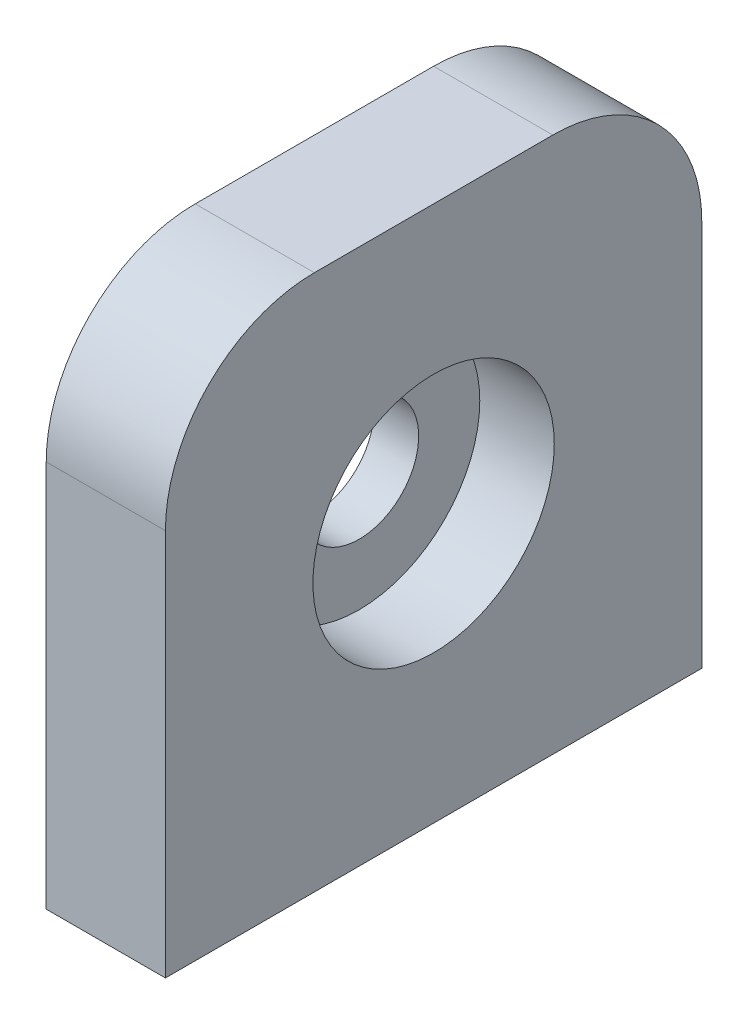
ISO-10303-21;
HEADER;
FILE_DESCRIPTION(('STEP AP214'),'2;1');
FILE_NAME('part.step','',(''),(''),'','','');
FILE_SCHEMA(('AUTOMOTIVE_DESIGN { 1 0 10303 214 1 1 1 1 }'));
ENDSEC;
DATA;
#1=APPLICATION_CONTEXT('core data for automotive mechanical design processes');
#2=APPLICATION_PROTOCOL_DEFINITION('international standard','automotive_design',2000,#1);
#3=PRODUCT_CONTEXT('',#1,'mechanical');
#4=PRODUCT('Part','Part','',(#3));
#5=PRODUCT_RELATED_PRODUCT_CATEGORY('part','',(#4));
#6=PRODUCT_DEFINITION_FORMATION('','',#4);
#7=PRODUCT_DEFINITION_CONTEXT('part definition',#1,'design');
#8=PRODUCT_DEFINITION('design','',#6,#7);
#9=PRODUCT_DEFINITION_SHAPE('','',#8);
#10=(LENGTH_UNIT() NAMED_UNIT(*) SI_UNIT(.MILLI.,.METRE.));
#11=(NAMED_UNIT(*) PLANE_ANGLE_UNIT() SI_UNIT($,.RADIAN.));
#12=(NAMED_UNIT(*) SI_UNIT($,.STERADIAN.) SOLID_ANGLE_UNIT());
#13=UNCERTAINTY_MEASURE_WITH_UNIT(LENGTH_MEASURE(1.E-05),#10,'distance_accuracy_value','');
#14=(GEOMETRIC_REPRESENTATION_CONTEXT(3) GLOBAL_UNCERTAINTY_ASSIGNED_CONTEXT((#13)) GLOBAL_UNIT_ASSIGNED_CONTEXT((#10,
#11,#12)) REPRESENTATION_CONTEXT('',''));
#15=CARTESIAN_POINT('',(0.,0.,0.));
#16=DIRECTION('',(0.,0.,1.));
#17=DIRECTION('',(1.,0.,0.));
#18=AXIS2_PLACEMENT_3D('',#15,#16,#17);
#19=CARTESIAN_POINT('',(-2.,18.,-18.));
#20=DIRECTION('',(1.,0.,0.));
#21=DIRECTION('',(0.,0.,-1.));
#22=AXIS2_PLACEMENT_3D('',#19,#20,#21);
#23=CYLINDRICAL_SURFACE('',#22,8.1);
#24=CARTESIAN_POINT('',(8.,18.,-18.));
#25=DIRECTION('',(1.,0.,0.));
#26=DIRECTION('',(0.,0.,-1.));
#27=AXIS2_PLACEMENT_3D('',#24,#25,#26);
#28=CIRCLE('',#27,8.1);
#29=CARTESIAN_POINT('',(8.,18.,-26.1));
#30=VERTEX_POINT('',#29);
#31=EDGE_CURVE('E116',#30,#30,#28,.T.);
#32=ORIENTED_EDGE('',*,*,#31,.T.);
#33=EDGE_LOOP('',(#32));
#34=FACE_BOUND('',#33,.T.);
#35=CARTESIAN_POINT('',(3.,18.,-18.));
#36=DIRECTION('',(-1.,0.,0.));
#37=DIRECTION('',(0.,0.,1.));
#38=AXIS2_PLACEMENT_3D('',#35,#36,#37);
#39=CIRCLE('',#38,8.1);
#40=CARTESIAN_POINT('',(3.,18.,-9.9));
#41=VERTEX_POINT('',#40);
#42=EDGE_CURVE('E105',#41,#41,#39,.F.);
#43=ORIENTED_EDGE('',*,*,#42,.F.);
#44=EDGE_LOOP('',(#43));
#45=FACE_BOUND('',#44,.T.);
#46=ADVANCED_FACE('F39',(#34,#45),#23,.F.);
#47=CARTESIAN_POINT('',(0.,36.,0.));
#48=DIRECTION('',(0.,0.,1.));
#49=DIRECTION('',(1.,0.,0.));
#50=AXIS2_PLACEMENT_3D('',#47,#48,#49);
#51=PLANE('',#50);
#52=DIRECTION('',(0.,-1.,0.));
#53=VECTOR('',#52,1.);
#54=CARTESIAN_POINT('',(8.,36.,0.));
#55=LINE('',#54,#53);
#56=CARTESIAN_POINT('',(8.,26.,0.));
#57=VERTEX_POINT('',#56);
#58=CARTESIAN_POINT('',(8.,0.,0.));
#59=VERTEX_POINT('',#58);
#60=EDGE_CURVE('E94',#57,#59,#55,.T.);
#61=ORIENTED_EDGE('',*,*,#60,.F.);
#62=DIRECTION('',(-1.,0.,0.));
#63=VECTOR('',#62,1.);
#64=CARTESIAN_POINT('',(0.,26.,0.));
#65=LINE('',#64,#63);
#66=CARTESIAN_POINT('',(0.,26.,0.));
#67=VERTEX_POINT('',#66);
#68=EDGE_CURVE('E11',#57,#67,#65,.T.);
#69=ORIENTED_EDGE('',*,*,#68,.T.);
#70=DIRECTION('',(0.,-1.,0.));
#71=VECTOR('',#70,1.);
#72=CARTESIAN_POINT('',(0.,36.,0.));
#73=LINE('',#72,#71);
#74=CARTESIAN_POINT('',(0.,0.,0.));
#75=VERTEX_POINT('',#74);
#76=EDGE_CURVE('E112',#67,#75,#73,.T.);
#77=ORIENTED_EDGE('',*,*,#76,.T.);
#78=DIRECTION('',(-1.,0.,0.));
#79=VECTOR('',#78,1.);
#80=CARTESIAN_POINT('',(0.,0.,0.));
#81=LINE('',#80,#79);
#82=EDGE_CURVE('E109',#59,#75,#81,.T.);
#83=ORIENTED_EDGE('',*,*,#82,.F.);
#84=EDGE_LOOP('',(#61,#69,#77,#83));
#85=FACE_BOUND('',#84,.T.);
#86=ADVANCED_FACE('F110',(#85),#51,.T.);
#87=CARTESIAN_POINT('',(8.,36.,0.));
#88=DIRECTION('',(1.,0.,0.));
#89=DIRECTION('',(0.,0.,-1.));
#90=AXIS2_PLACEMENT_3D('',#87,#88,#89);
#91=PLANE('',#90);
#92=ORIENTED_EDGE('',*,*,#31,.F.);
#93=EDGE_LOOP('',(#92));
#94=FACE_BOUND('',#93,.T.);
#95=DIRECTION('',(0.,-1.,0.));
#96=VECTOR('',#95,1.);
#97=CARTESIAN_POINT('',(8.,36.,-36.));
#98=LINE('',#97,#96);
#99=CARTESIAN_POINT('',(8.,26.,-36.));
#100=VERTEX_POINT('',#99);
#101=CARTESIAN_POINT('',(8.,0.,-36.));
#102=VERTEX_POINT('',#101);
#103=EDGE_CURVE('E106',#100,#102,#98,.T.);
#104=ORIENTED_EDGE('',*,*,#103,.F.);
#105=CARTESIAN_POINT('',(8.,26.,-26.));
#106=DIRECTION('',(1.,0.,0.));
#107=DIRECTION('',(0.,0.,-1.));
#108=AXIS2_PLACEMENT_3D('',#105,#106,#107);
#109=CIRCLE('',#108,10.);
#110=CARTESIAN_POINT('',(8.,36.,-26.));
#111=VERTEX_POINT('',#110);
#112=EDGE_CURVE('E139',#100,#111,#109,.T.);
#113=ORIENTED_EDGE('',*,*,#112,.T.);
#114=DIRECTION('',(0.,0.,1.));
#115=VECTOR('',#114,1.);
#116=CARTESIAN_POINT('',(8.,36.,0.));
#117=LINE('',#116,#115);
#118=CARTESIAN_POINT('',(8.,36.,-10.));
#119=VERTEX_POINT('',#118);
#120=EDGE_CURVE('E127',#111,#119,#117,.T.);
#121=ORIENTED_EDGE('',*,*,#120,.T.);
#122=CARTESIAN_POINT('',(8.,26.,-10.));
#123=DIRECTION('',(1.,0.,0.));
#124=DIRECTION('',(0.,0.,-1.));
#125=AXIS2_PLACEMENT_3D('',#122,#123,#124);
#126=CIRCLE('',#125,10.);
#127=EDGE_CURVE('E103',#119,#57,#126,.T.);
#128=ORIENTED_EDGE('',*,*,#127,.T.);
#129=ORIENTED_EDGE('',*,*,#60,.T.);
#130=DIRECTION('',(0.,0.,1.));
#131=VECTOR('',#130,1.);
#132=CARTESIAN_POINT('',(8.,0.,0.));
#133=LINE('',#132,#131);
#134=EDGE_CURVE('E99',#102,#59,#133,.T.);
#135=ORIENTED_EDGE('',*,*,#134,.F.);
#136=EDGE_LOOP('',(#104,#113,#121,#128,#129,#135));
#137=FACE_BOUND('',#136,.T.);
#138=ADVANCED_FACE('F97',(#94,#137),#91,.T.);
#139=CARTESIAN_POINT('',(0.,36.,-36.));
#140=DIRECTION('',(0.,0.,-1.));
#141=DIRECTION('',(-1.,0.,0.));
#142=AXIS2_PLACEMENT_3D('',#139,#140,#141);
#143=PLANE('',#142);
#144=DIRECTION('',(0.,-1.,0.));
#145=VECTOR('',#144,1.);
#146=CARTESIAN_POINT('',(0.,36.,-36.));
#147=LINE('',#146,#145);
#148=CARTESIAN_POINT('',(0.,26.,-36.));
#149=VERTEX_POINT('',#148);
#150=CARTESIAN_POINT('',(0.,0.,-36.));
#151=VERTEX_POINT('',#150);
#152=EDGE_CURVE('E129',#149,#151,#147,.T.);
#153=ORIENTED_EDGE('',*,*,#152,.F.);
#154=DIRECTION('',(1.,0.,0.));
#155=VECTOR('',#154,1.);
#156=CARTESIAN_POINT('',(0.,26.,-36.));
#157=LINE('',#156,#155);
#158=EDGE_CURVE('E135',#149,#100,#157,.T.);
#159=ORIENTED_EDGE('',*,*,#158,.T.);
#160=ORIENTED_EDGE('',*,*,#103,.T.);
#161=DIRECTION('',(1.,0.,0.));
#162=VECTOR('',#161,1.);
#163=CARTESIAN_POINT('',(0.,0.,-36.));
#164=LINE('',#163,#162);
#165=EDGE_CURVE('E120',#151,#102,#164,.T.);
#166=ORIENTED_EDGE('',*,*,#165,.F.);
#167=EDGE_LOOP('',(#153,#159,#160,#166));
#168=FACE_BOUND('',#167,.T.);
#169=ADVANCED_FACE('F152',(#168),#143,.T.);
#170=CARTESIAN_POINT('',(0.,36.,0.));
#171=DIRECTION('',(-1.,0.,0.));
#172=DIRECTION('',(0.,0.,1.));
#173=AXIS2_PLACEMENT_3D('',#170,#171,#172);
#174=PLANE('',#173);
#175=DIRECTION('',(0.,0.,-1.));
#176=VECTOR('',#175,1.);
#177=CARTESIAN_POINT('',(0.,36.,0.));
#178=LINE('',#177,#176);
#179=CARTESIAN_POINT('',(0.,36.,-10.));
#180=VERTEX_POINT('',#179);
#181=CARTESIAN_POINT('',(0.,36.,-26.));
#182=VERTEX_POINT('',#181);
#183=EDGE_CURVE('E130',#180,#182,#178,.T.);
#184=ORIENTED_EDGE('',*,*,#183,.T.);
#185=CARTESIAN_POINT('',(0.,26.,-26.));
#186=DIRECTION('',(-1.,0.,0.));
#187=DIRECTION('',(0.,0.,1.));
#188=AXIS2_PLACEMENT_3D('',#185,#186,#187);
#189=CIRCLE('',#188,10.);
#190=EDGE_CURVE('E47',#182,#149,#189,.T.);
#191=ORIENTED_EDGE('',*,*,#190,.T.);
#192=ORIENTED_EDGE('',*,*,#152,.T.);
#193=DIRECTION('',(0.,0.,-1.));
#194=VECTOR('',#193,1.);
#195=CARTESIAN_POINT('',(0.,0.,0.));
#196=LINE('',#195,#194);
#197=EDGE_CURVE('E122',#75,#151,#196,.T.);
#198=ORIENTED_EDGE('',*,*,#197,.F.);
#199=ORIENTED_EDGE('',*,*,#76,.F.);
#200=CARTESIAN_POINT('',(0.,26.,-10.));
#201=DIRECTION('',(-1.,0.,0.));
#202=DIRECTION('',(0.,0.,1.));
#203=AXIS2_PLACEMENT_3D('',#200,#201,#202);
#204=CIRCLE('',#203,10.);
#205=EDGE_CURVE('E54',#67,#180,#204,.T.);
#206=ORIENTED_EDGE('',*,*,#205,.T.);
#207=EDGE_LOOP('',(#184,#191,#192,#198,#199,#206));
#208=FACE_BOUND('',#207,.T.);
#209=CARTESIAN_POINT('',(0.,18.,-18.));
#210=DIRECTION('',(-1.,0.,0.));
#211=DIRECTION('',(0.,0.,1.));
#212=AXIS2_PLACEMENT_3D('',#209,#210,#211);
#213=CIRCLE('',#212,4.);
#214=CARTESIAN_POINT('',(0.,18.,-14.));
#215=VERTEX_POINT('',#214);
#216=EDGE_CURVE('E160',#215,#215,#213,.T.);
#217=ORIENTED_EDGE('',*,*,#216,.F.);
#218=EDGE_LOOP('',(#217));
#219=FACE_BOUND('',#218,.T.);
#220=ADVANCED_FACE('F147',(#208,#219),#174,.T.);
#221=CARTESIAN_POINT('',(0.,36.,0.));
#222=DIRECTION('',(0.,1.,0.));
#223=DIRECTION('',(0.,0.,1.));
#224=AXIS2_PLACEMENT_3D('',#221,#222,#223);
#225=PLANE('',#224);
#226=ORIENTED_EDGE('',*,*,#120,.F.);
#227=DIRECTION('',(1.,0.,0.));
#228=VECTOR('',#227,1.);
#229=CARTESIAN_POINT('',(0.,36.,-26.));
#230=LINE('',#229,#228);
#231=EDGE_CURVE('E61',#111,#182,#230,.F.);
#232=ORIENTED_EDGE('',*,*,#231,.T.);
#233=ORIENTED_EDGE('',*,*,#183,.F.);
#234=DIRECTION('',(-1.,0.,0.));
#235=VECTOR('',#234,1.);
#236=CARTESIAN_POINT('',(0.,36.,-10.));
#237=LINE('',#236,#235);
#238=EDGE_CURVE('E141',#180,#119,#237,.F.);
#239=ORIENTED_EDGE('',*,*,#238,.T.);
#240=EDGE_LOOP('',(#226,#232,#233,#239));
#241=FACE_BOUND('',#240,.T.);
#242=ADVANCED_FACE('F154',(#241),#225,.T.);
#243=CARTESIAN_POINT('',(0.,0.,0.));
#244=DIRECTION('',(0.,1.,0.));
#245=DIRECTION('',(0.,0.,1.));
#246=AXIS2_PLACEMENT_3D('',#243,#244,#245);
#247=PLANE('',#246);
#248=CARTESIAN_POINT('',(4.,0.,-4.));
#249=DIRECTION('',(0.,-1.,0.));
#250=DIRECTION('',(0.,0.,-1.));
#251=AXIS2_PLACEMENT_3D('',#248,#249,#250);
#252=CIRCLE('',#251,2.);
#253=CARTESIAN_POINT('',(4.,0.,-6.));
#254=VERTEX_POINT('',#253);
#255=EDGE_CURVE('E172',#254,#254,#252,.T.);
#256=ORIENTED_EDGE('',*,*,#255,.F.);
#257=EDGE_LOOP('',(#256));
#258=FACE_BOUND('',#257,.T.);
#259=CARTESIAN_POINT('',(4.,0.,-32.));
#260=DIRECTION('',(0.,-1.,0.));
#261=DIRECTION('',(0.,0.,-1.));
#262=AXIS2_PLACEMENT_3D('',#259,#260,#261);
#263=CIRCLE('',#262,2.);
#264=CARTESIAN_POINT('',(4.,0.,-34.));
#265=VERTEX_POINT('',#264);
#266=EDGE_CURVE('E166',#265,#265,#263,.T.);
#267=ORIENTED_EDGE('',*,*,#266,.F.);
#268=EDGE_LOOP('',(#267));
#269=FACE_BOUND('',#268,.T.);
#270=ORIENTED_EDGE('',*,*,#82,.T.);
#271=ORIENTED_EDGE('',*,*,#197,.T.);
#272=ORIENTED_EDGE('',*,*,#165,.T.);
#273=ORIENTED_EDGE('',*,*,#134,.T.);
#274=EDGE_LOOP('',(#270,#271,#272,#273));
#275=FACE_BOUND('',#274,.T.);
#276=ADVANCED_FACE('F118',(#258,#269,#275),#247,.F.);
#277=CARTESIAN_POINT('',(3.,18.,-18.));
#278=DIRECTION('',(-1.,0.,0.));
#279=DIRECTION('',(0.,0.,1.));
#280=AXIS2_PLACEMENT_3D('',#277,#278,#279);
#281=PLANE('',#280);
#282=CARTESIAN_POINT('',(3.,18.,-18.));
#283=DIRECTION('',(-1.,0.,0.));
#284=DIRECTION('',(0.,0.,1.));
#285=AXIS2_PLACEMENT_3D('',#282,#283,#284);
#286=CIRCLE('',#285,4.);
#287=CARTESIAN_POINT('',(3.,18.,-14.));
#288=VERTEX_POINT('',#287);
#289=EDGE_CURVE('E159',#288,#288,#286,.T.);
#290=ORIENTED_EDGE('',*,*,#289,.T.);
#291=EDGE_LOOP('',(#290));
#292=FACE_BOUND('',#291,.T.);
#293=ORIENTED_EDGE('',*,*,#42,.T.);
#294=EDGE_LOOP('',(#293));
#295=FACE_BOUND('',#294,.T.);
#296=ADVANCED_FACE('F189',(#292,#295),#281,.F.);
#297=CARTESIAN_POINT('',(3.,18.,-18.));
#298=DIRECTION('',(-1.,0.,0.));
#299=DIRECTION('',(0.,0.,1.));
#300=AXIS2_PLACEMENT_3D('',#297,#298,#299);
#301=CYLINDRICAL_SURFACE('',#300,4.);
#302=ORIENTED_EDGE('',*,*,#289,.F.);
#303=EDGE_LOOP('',(#302));
#304=FACE_BOUND('',#303,.T.);
#305=ORIENTED_EDGE('',*,*,#216,.T.);
#306=EDGE_LOOP('',(#305));
#307=FACE_BOUND('',#306,.T.);
#308=ADVANCED_FACE('F195',(#304,#307),#301,.F.);
#309=CARTESIAN_POINT('',(4.,15.,-32.));
#310=DIRECTION('',(0.,-1.,0.));
#311=DIRECTION('',(0.,0.,-1.));
#312=AXIS2_PLACEMENT_3D('',#309,#310,#311);
#313=CYLINDRICAL_SURFACE('',#312,2.);
#314=CARTESIAN_POINT('',(4.,15.,-32.));
#315=DIRECTION('',(0.,-1.,0.));
#316=DIRECTION('',(0.,0.,-1.));
#317=AXIS2_PLACEMENT_3D('',#314,#315,#316);
#318=CIRCLE('',#317,2.);
#319=CARTESIAN_POINT('',(4.,15.,-34.));
#320=VERTEX_POINT('',#319);
#321=EDGE_CURVE('E169',#320,#320,#318,.T.);
#322=ORIENTED_EDGE('',*,*,#321,.F.);
#323=EDGE_LOOP('',(#322));
#324=FACE_BOUND('',#323,.T.);
#325=ORIENTED_EDGE('',*,*,#266,.T.);
#326=EDGE_LOOP('',(#325));
#327=FACE_BOUND('',#326,.T.);
#328=ADVANCED_FACE('F193',(#324,#327),#313,.F.);
#329=CARTESIAN_POINT('',(4.,15.,-32.));
#330=DIRECTION('',(0.,-1.,0.));
#331=DIRECTION('',(0.,0.,-1.));
#332=AXIS2_PLACEMENT_3D('',#329,#330,#331);
#333=PLANE('',#332);
#334=ORIENTED_EDGE('',*,*,#321,.T.);
#335=EDGE_LOOP('',(#334));
#336=FACE_BOUND('',#335,.T.);
#337=ADVANCED_FACE('F183',(#336),#333,.T.);
#338=CARTESIAN_POINT('',(4.,15.,-4.));
#339=DIRECTION('',(0.,-1.,0.));
#340=DIRECTION('',(0.,0.,-1.));
#341=AXIS2_PLACEMENT_3D('',#338,#339,#340);
#342=CYLINDRICAL_SURFACE('',#341,2.);
#343=CARTESIAN_POINT('',(4.,15.,-4.));
#344=DIRECTION('',(0.,-1.,0.));
#345=DIRECTION('',(0.,0.,-1.));
#346=AXIS2_PLACEMENT_3D('',#343,#344,#345);
#347=CIRCLE('',#346,2.);
#348=CARTESIAN_POINT('',(4.,15.,-6.));
#349=VERTEX_POINT('',#348);
#350=EDGE_CURVE('E163',#349,#349,#347,.T.);
#351=ORIENTED_EDGE('',*,*,#350,.F.);
#352=EDGE_LOOP('',(#351));
#353=FACE_BOUND('',#352,.T.);
#354=ORIENTED_EDGE('',*,*,#255,.T.);
#355=EDGE_LOOP('',(#354));
#356=FACE_BOUND('',#355,.T.);
#357=ADVANCED_FACE('F180',(#353,#356),#342,.F.);
#358=CARTESIAN_POINT('',(4.,15.,-4.));
#359=DIRECTION('',(0.,-1.,0.));
#360=DIRECTION('',(0.,0.,-1.));
#361=AXIS2_PLACEMENT_3D('',#358,#359,#360);
#362=PLANE('',#361);
#363=ORIENTED_EDGE('',*,*,#350,.T.);
#364=EDGE_LOOP('',(#363));
#365=FACE_BOUND('',#364,.T.);
#366=ADVANCED_FACE('F178',(#365),#362,.T.);
#367=CARTESIAN_POINT('',(0.,26.,-26.));
#368=DIRECTION('',(1.,0.,0.));
#369=DIRECTION('',(0.,0.,-1.));
#370=AXIS2_PLACEMENT_3D('',#367,#368,#369);
#371=CYLINDRICAL_SURFACE('',#370,10.);
#372=ORIENTED_EDGE('',*,*,#190,.F.);
#373=ORIENTED_EDGE('',*,*,#231,.F.);
#374=ORIENTED_EDGE('',*,*,#112,.F.);
#375=ORIENTED_EDGE('',*,*,#158,.F.);
#376=EDGE_LOOP('',(#372,#373,#374,#375));
#377=FACE_BOUND('',#376,.T.);
#378=ADVANCED_FACE('F153',(#377),#371,.T.);
#379=CARTESIAN_POINT('',(0.,26.,-10.));
#380=DIRECTION('',(-1.,0.,0.));
#381=DIRECTION('',(0.,0.,1.));
#382=AXIS2_PLACEMENT_3D('',#379,#380,#381);
#383=CYLINDRICAL_SURFACE('',#382,10.);
#384=ORIENTED_EDGE('',*,*,#127,.F.);
#385=ORIENTED_EDGE('',*,*,#238,.F.);
#386=ORIENTED_EDGE('',*,*,#205,.F.);
#387=ORIENTED_EDGE('',*,*,#68,.F.);
#388=EDGE_LOOP('',(#384,#385,#386,#387));
#389=FACE_BOUND('',#388,.T.);
#390=ADVANCED_FACE('F41',(#389),#383,.T.);
#391=CLOSED_SHELL('',(#46,#86,#138,#169,#220,#242,#276,#296,#308,#328,#337,#357,#366,#378,#390));
#392=MANIFOLD_SOLID_BREP('B2',#391);
#393=ADVANCED_BREP_SHAPE_REPRESENTATION('',(#18,#392),#14);
#394=SHAPE_DEFINITION_REPRESENTATION(#9,#393);
ENDSEC;
END-ISO-10303-21;
